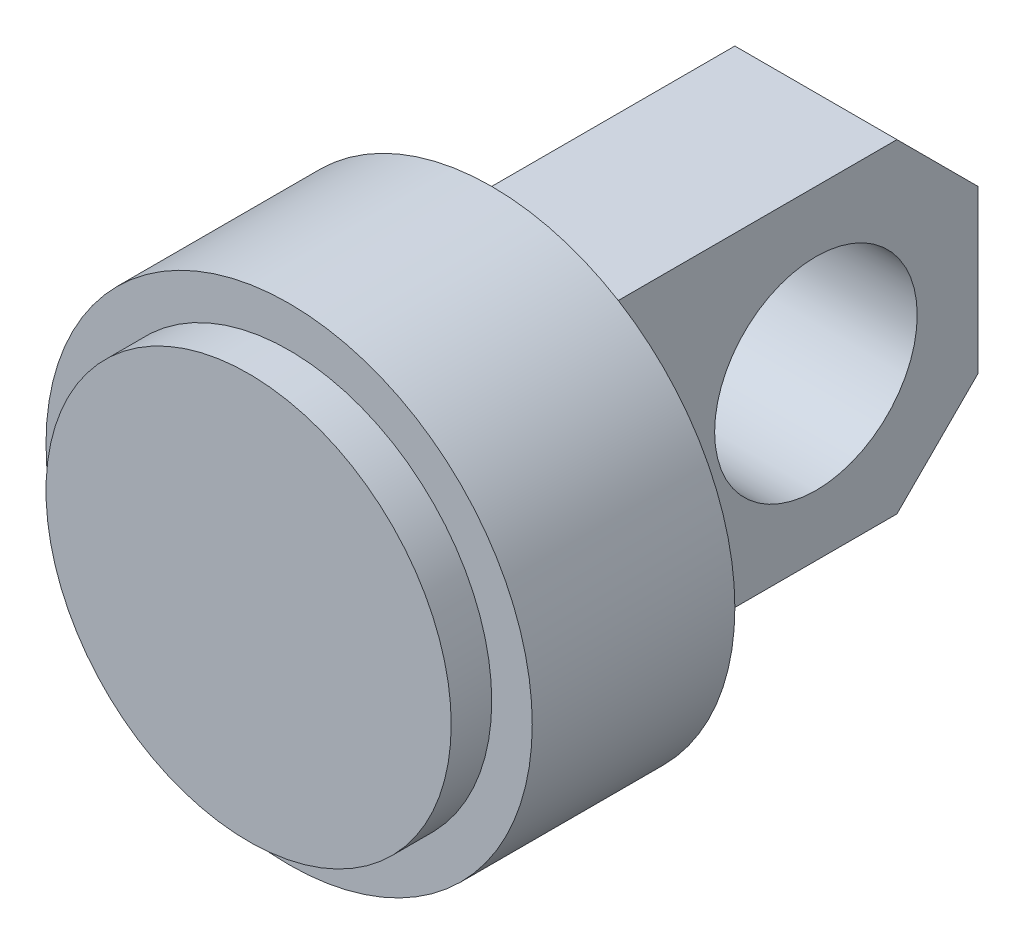
ISO-10303-21;
HEADER;
FILE_DESCRIPTION(('STEP AP214'),'2;1');
FILE_NAME('part.step','',(''),(''),'','','');
FILE_SCHEMA(('AUTOMOTIVE_DESIGN { 1 0 10303 214 1 1 1 1 }'));
ENDSEC;
DATA;
#1=APPLICATION_CONTEXT('core data for automotive mechanical design processes');
#2=APPLICATION_PROTOCOL_DEFINITION('international standard','automotive_design',2000,#1);
#3=PRODUCT_CONTEXT('',#1,'mechanical');
#4=PRODUCT('Part','Part','',(#3));
#5=PRODUCT_RELATED_PRODUCT_CATEGORY('part','',(#4));
#6=PRODUCT_DEFINITION_FORMATION('','',#4);
#7=PRODUCT_DEFINITION_CONTEXT('part definition',#1,'design');
#8=PRODUCT_DEFINITION('design','',#6,#7);
#9=PRODUCT_DEFINITION_SHAPE('','',#8);
#10=(LENGTH_UNIT() NAMED_UNIT(*) SI_UNIT(.MILLI.,.METRE.));
#11=(NAMED_UNIT(*) PLANE_ANGLE_UNIT() SI_UNIT($,.RADIAN.));
#12=(NAMED_UNIT(*) SI_UNIT($,.STERADIAN.) SOLID_ANGLE_UNIT());
#13=UNCERTAINTY_MEASURE_WITH_UNIT(LENGTH_MEASURE(1.E-05),#10,'distance_accuracy_value','');
#14=(GEOMETRIC_REPRESENTATION_CONTEXT(3) GLOBAL_UNCERTAINTY_ASSIGNED_CONTEXT((#13)) GLOBAL_UNIT_ASSIGNED_CONTEXT((#10,
#11,#12)) REPRESENTATION_CONTEXT('',''));
#15=CARTESIAN_POINT('',(0.,0.,0.));
#16=DIRECTION('',(0.,0.,1.));
#17=DIRECTION('',(1.,0.,0.));
#18=AXIS2_PLACEMENT_3D('',#15,#16,#17);
#19=CARTESIAN_POINT('',(0.,0.,5.));
#20=DIRECTION('',(0.,0.,-1.));
#21=DIRECTION('',(-1.,0.,0.));
#22=AXIS2_PLACEMENT_3D('',#19,#20,#21);
#23=CYLINDRICAL_SURFACE('',#22,25.);
#24=CARTESIAN_POINT('',(0.,0.,5.));
#25=DIRECTION('',(0.,0.,1.));
#26=DIRECTION('',(1.,0.,0.));
#27=AXIS2_PLACEMENT_3D('',#24,#25,#26);
#28=CIRCLE('',#27,25.);
#29=CARTESIAN_POINT('',(25.,0.,5.));
#30=VERTEX_POINT('',#29);
#31=EDGE_CURVE('E147',#30,#30,#28,.T.);
#32=ORIENTED_EDGE('',*,*,#31,.F.);
#33=EDGE_LOOP('',(#32));
#34=FACE_BOUND('',#33,.T.);
#35=CARTESIAN_POINT('',(0.,0.,0.));
#36=DIRECTION('',(0.,0.,1.));
#37=DIRECTION('',(1.,0.,0.));
#38=AXIS2_PLACEMENT_3D('',#35,#36,#37);
#39=CIRCLE('',#38,25.);
#40=CARTESIAN_POINT('',(25.,0.,0.));
#41=VERTEX_POINT('',#40);
#42=EDGE_CURVE('E143',#41,#41,#39,.T.);
#43=ORIENTED_EDGE('',*,*,#42,.T.);
#44=EDGE_LOOP('',(#43));
#45=FACE_BOUND('',#44,.T.);
#46=ADVANCED_FACE('F41',(#34,#45),#23,.T.);
#47=CARTESIAN_POINT('',(0.,0.,5.));
#48=DIRECTION('',(0.,0.,1.));
#49=DIRECTION('',(1.,0.,0.));
#50=AXIS2_PLACEMENT_3D('',#47,#48,#49);
#51=PLANE('',#50);
#52=ORIENTED_EDGE('',*,*,#31,.T.);
#53=EDGE_LOOP('',(#52));
#54=FACE_BOUND('',#53,.T.);
#55=ADVANCED_FACE('F197',(#54),#51,.T.);
#56=CARTESIAN_POINT('',(0.,0.,-25.));
#57=DIRECTION('',(0.,0.,1.));
#58=DIRECTION('',(1.,0.,0.));
#59=AXIS2_PLACEMENT_3D('',#56,#57,#58);
#60=CYLINDRICAL_SURFACE('',#59,30.);
#61=CARTESIAN_POINT('',(0.,0.,-25.));
#62=DIRECTION('',(0.,0.,-1.));
#63=DIRECTION('',(-1.,0.,0.));
#64=AXIS2_PLACEMENT_3D('',#61,#62,#63);
#65=CIRCLE('',#64,30.);
#66=CARTESIAN_POINT('',(-30.,0.,-25.));
#67=VERTEX_POINT('',#66);
#68=EDGE_CURVE('E139',#67,#67,#65,.T.);
#69=ORIENTED_EDGE('',*,*,#68,.F.);
#70=EDGE_LOOP('',(#69));
#71=FACE_BOUND('',#70,.T.);
#72=CARTESIAN_POINT('',(0.,0.,0.));
#73=DIRECTION('',(0.,0.,-1.));
#74=DIRECTION('',(-1.,0.,0.));
#75=AXIS2_PLACEMENT_3D('',#72,#73,#74);
#76=CIRCLE('',#75,30.);
#77=CARTESIAN_POINT('',(-30.,0.,0.));
#78=VERTEX_POINT('',#77);
#79=EDGE_CURVE('E138',#78,#78,#76,.T.);
#80=ORIENTED_EDGE('',*,*,#79,.T.);
#81=EDGE_LOOP('',(#80));
#82=FACE_BOUND('',#81,.T.);
#83=ADVANCED_FACE('F203',(#71,#82),#60,.T.);
#84=CARTESIAN_POINT('',(0.,0.,-25.));
#85=DIRECTION('',(0.,0.,-1.));
#86=DIRECTION('',(-1.,0.,0.));
#87=AXIS2_PLACEMENT_3D('',#84,#85,#86);
#88=PLANE('',#87);
#89=DIRECTION('',(0.,1.,0.));
#90=VECTOR('',#89,1.);
#91=CARTESIAN_POINT('',(-10.,-20.,-25.));
#92=LINE('',#91,#90);
#93=CARTESIAN_POINT('',(-10.,-20.,-25.));
#94=VERTEX_POINT('',#93);
#95=CARTESIAN_POINT('',(-10.,20.,-25.));
#96=VERTEX_POINT('',#95);
#97=EDGE_CURVE('E121',#94,#96,#92,.T.);
#98=ORIENTED_EDGE('',*,*,#97,.F.);
#99=DIRECTION('',(-1.,0.,0.));
#100=VECTOR('',#99,1.);
#101=CARTESIAN_POINT('',(10.,-20.,-25.));
#102=LINE('',#101,#100);
#103=CARTESIAN_POINT('',(10.,-20.,-25.));
#104=VERTEX_POINT('',#103);
#105=EDGE_CURVE('E115',#104,#94,#102,.T.);
#106=ORIENTED_EDGE('',*,*,#105,.F.);
#107=DIRECTION('',(0.,-1.,0.));
#108=VECTOR('',#107,1.);
#109=CARTESIAN_POINT('',(10.,-20.,-25.));
#110=LINE('',#109,#108);
#111=CARTESIAN_POINT('',(10.,20.,-25.));
#112=VERTEX_POINT('',#111);
#113=EDGE_CURVE('E98',#112,#104,#110,.T.);
#114=ORIENTED_EDGE('',*,*,#113,.F.);
#115=DIRECTION('',(1.,0.,0.));
#116=VECTOR('',#115,1.);
#117=CARTESIAN_POINT('',(10.,20.,-25.));
#118=LINE('',#117,#116);
#119=EDGE_CURVE('E112',#96,#112,#118,.T.);
#120=ORIENTED_EDGE('',*,*,#119,.F.);
#121=EDGE_LOOP('',(#98,#106,#114,#120));
#122=FACE_BOUND('',#121,.T.);
#123=ORIENTED_EDGE('',*,*,#68,.T.);
#124=EDGE_LOOP('',(#123));
#125=FACE_BOUND('',#124,.T.);
#126=ADVANCED_FACE('F110',(#122,#125),#88,.T.);
#127=CARTESIAN_POINT('',(0.,0.,0.));
#128=DIRECTION('',(0.,0.,-1.));
#129=DIRECTION('',(-1.,0.,0.));
#130=AXIS2_PLACEMENT_3D('',#127,#128,#129);
#131=PLANE('',#130);
#132=ORIENTED_EDGE('',*,*,#42,.F.);
#133=EDGE_LOOP('',(#132));
#134=FACE_BOUND('',#133,.T.);
#135=ORIENTED_EDGE('',*,*,#79,.F.);
#136=EDGE_LOOP('',(#135));
#137=FACE_BOUND('',#136,.T.);
#138=ADVANCED_FACE('F237',(#134,#137),#131,.F.);
#139=CARTESIAN_POINT('',(-10.,-20.,-75.));
#140=DIRECTION('',(1.,0.,0.));
#141=DIRECTION('',(0.,0.,-1.));
#142=AXIS2_PLACEMENT_3D('',#139,#140,#141);
#143=PLANE('',#142);
#144=CARTESIAN_POINT('',(-10.,0.,-55.));
#145=DIRECTION('',(-1.,0.,0.));
#146=DIRECTION('',(0.,0.,1.));
#147=AXIS2_PLACEMENT_3D('',#144,#145,#146);
#148=CIRCLE('',#147,12.5);
#149=CARTESIAN_POINT('',(-10.,0.,-42.5));
#150=VERTEX_POINT('',#149);
#151=EDGE_CURVE('E227',#150,#150,#148,.T.);
#152=ORIENTED_EDGE('',*,*,#151,.F.);
#153=EDGE_LOOP('',(#152));
#154=FACE_BOUND('',#153,.T.);
#155=DIRECTION('',(0.,1.,0.));
#156=VECTOR('',#155,1.);
#157=CARTESIAN_POINT('',(-10.,-20.,-75.));
#158=LINE('',#157,#156);
#159=CARTESIAN_POINT('',(-10.,-9.99999999999998,-75.));
#160=VERTEX_POINT('',#159);
#161=CARTESIAN_POINT('',(-10.,9.99999999999996,-75.));
#162=VERTEX_POINT('',#161);
#163=EDGE_CURVE('E129',#160,#162,#158,.T.);
#164=ORIENTED_EDGE('',*,*,#163,.F.);
#165=DIRECTION('',(0.,0.707106781186548,-0.707106781186548));
#166=VECTOR('',#165,1.);
#167=CARTESIAN_POINT('',(-10.,-9.99999999999998,-75.));
#168=LINE('',#167,#166);
#169=CARTESIAN_POINT('',(-10.,-20.,-65.));
#170=VERTEX_POINT('',#169);
#171=EDGE_CURVE('E165',#160,#170,#168,.F.);
#172=ORIENTED_EDGE('',*,*,#171,.T.);
#173=DIRECTION('',(0.,0.,1.));
#174=VECTOR('',#173,1.);
#175=CARTESIAN_POINT('',(-10.,-20.,-75.));
#176=LINE('',#175,#174);
#177=EDGE_CURVE('E130',#170,#94,#176,.T.);
#178=ORIENTED_EDGE('',*,*,#177,.T.);
#179=ORIENTED_EDGE('',*,*,#97,.T.);
#180=DIRECTION('',(0.,0.,1.));
#181=VECTOR('',#180,1.);
#182=CARTESIAN_POINT('',(-10.,20.,-75.));
#183=LINE('',#182,#181);
#184=CARTESIAN_POINT('',(-10.,20.,-65.));
#185=VERTEX_POINT('',#184);
#186=EDGE_CURVE('E103',#185,#96,#183,.T.);
#187=ORIENTED_EDGE('',*,*,#186,.F.);
#188=DIRECTION('',(0.,0.707106781186548,0.707106781186547));
#189=VECTOR('',#188,1.);
#190=CARTESIAN_POINT('',(-10.,9.99999999999996,-75.));
#191=LINE('',#190,#189);
#192=EDGE_CURVE('E162',#185,#162,#191,.F.);
#193=ORIENTED_EDGE('',*,*,#192,.T.);
#194=EDGE_LOOP('',(#164,#172,#178,#179,#187,#193));
#195=FACE_BOUND('',#194,.T.);
#196=ADVANCED_FACE('F185',(#154,#195),#143,.F.);
#197=CARTESIAN_POINT('',(10.,20.,-75.));
#198=DIRECTION('',(0.,-1.,0.));
#199=DIRECTION('',(0.,0.,-1.));
#200=AXIS2_PLACEMENT_3D('',#197,#198,#199);
#201=PLANE('',#200);
#202=DIRECTION('',(0.,0.,1.));
#203=VECTOR('',#202,1.);
#204=CARTESIAN_POINT('',(10.,20.,-75.));
#205=LINE('',#204,#203);
#206=CARTESIAN_POINT('',(10.,20.,-65.));
#207=VERTEX_POINT('',#206);
#208=EDGE_CURVE('E95',#207,#112,#205,.T.);
#209=ORIENTED_EDGE('',*,*,#208,.F.);
#210=DIRECTION('',(-1.,0.,0.));
#211=VECTOR('',#210,1.);
#212=CARTESIAN_POINT('',(10.,20.,-65.));
#213=LINE('',#212,#211);
#214=EDGE_CURVE('E11',#207,#185,#213,.T.);
#215=ORIENTED_EDGE('',*,*,#214,.T.);
#216=ORIENTED_EDGE('',*,*,#186,.T.);
#217=ORIENTED_EDGE('',*,*,#119,.T.);
#218=EDGE_LOOP('',(#209,#215,#216,#217));
#219=FACE_BOUND('',#218,.T.);
#220=ADVANCED_FACE('F118',(#219),#201,.F.);
#221=CARTESIAN_POINT('',(10.,-20.,-75.));
#222=DIRECTION('',(-1.,0.,0.));
#223=DIRECTION('',(0.,0.,1.));
#224=AXIS2_PLACEMENT_3D('',#221,#222,#223);
#225=PLANE('',#224);
#226=CARTESIAN_POINT('',(10.,0.,-55.));
#227=DIRECTION('',(-1.,0.,0.));
#228=DIRECTION('',(0.,0.,1.));
#229=AXIS2_PLACEMENT_3D('',#226,#227,#228);
#230=CIRCLE('',#229,12.5);
#231=CARTESIAN_POINT('',(10.,0.,-42.5));
#232=VERTEX_POINT('',#231);
#233=EDGE_CURVE('E46',#232,#232,#230,.T.);
#234=ORIENTED_EDGE('',*,*,#233,.T.);
#235=EDGE_LOOP('',(#234));
#236=FACE_BOUND('',#235,.T.);
#237=DIRECTION('',(0.,0.,1.));
#238=VECTOR('',#237,1.);
#239=CARTESIAN_POINT('',(10.,-20.,-75.));
#240=LINE('',#239,#238);
#241=CARTESIAN_POINT('',(10.,-20.,-65.));
#242=VERTEX_POINT('',#241);
#243=EDGE_CURVE('E104',#242,#104,#240,.T.);
#244=ORIENTED_EDGE('',*,*,#243,.F.);
#245=DIRECTION('',(0.,-0.707106781186548,0.707106781186548));
#246=VECTOR('',#245,1.);
#247=CARTESIAN_POINT('',(10.,-9.99999999999998,-75.));
#248=LINE('',#247,#246);
#249=CARTESIAN_POINT('',(10.,-9.99999999999998,-75.));
#250=VERTEX_POINT('',#249);
#251=EDGE_CURVE('E52',#242,#250,#248,.F.);
#252=ORIENTED_EDGE('',*,*,#251,.T.);
#253=DIRECTION('',(0.,-1.,0.));
#254=VECTOR('',#253,1.);
#255=CARTESIAN_POINT('',(10.,-20.,-75.));
#256=LINE('',#255,#254);
#257=CARTESIAN_POINT('',(10.,9.99999999999996,-75.));
#258=VERTEX_POINT('',#257);
#259=EDGE_CURVE('E133',#258,#250,#256,.T.);
#260=ORIENTED_EDGE('',*,*,#259,.F.);
#261=DIRECTION('',(0.,-0.707106781186548,-0.707106781186547));
#262=VECTOR('',#261,1.);
#263=CARTESIAN_POINT('',(10.,9.99999999999996,-75.));
#264=LINE('',#263,#262);
#265=EDGE_CURVE('E59',#258,#207,#264,.F.);
#266=ORIENTED_EDGE('',*,*,#265,.T.);
#267=ORIENTED_EDGE('',*,*,#208,.T.);
#268=ORIENTED_EDGE('',*,*,#113,.T.);
#269=EDGE_LOOP('',(#244,#252,#260,#266,#267,#268));
#270=FACE_BOUND('',#269,.T.);
#271=ADVANCED_FACE('F97',(#236,#270),#225,.F.);
#272=CARTESIAN_POINT('',(10.,-20.,-75.));
#273=DIRECTION('',(0.,1.,0.));
#274=DIRECTION('',(0.,0.,1.));
#275=AXIS2_PLACEMENT_3D('',#272,#273,#274);
#276=PLANE('',#275);
#277=ORIENTED_EDGE('',*,*,#177,.F.);
#278=DIRECTION('',(1.,0.,0.));
#279=VECTOR('',#278,1.);
#280=CARTESIAN_POINT('',(10.,-20.,-65.));
#281=LINE('',#280,#279);
#282=EDGE_CURVE('E67',#170,#242,#281,.T.);
#283=ORIENTED_EDGE('',*,*,#282,.T.);
#284=ORIENTED_EDGE('',*,*,#243,.T.);
#285=ORIENTED_EDGE('',*,*,#105,.T.);
#286=EDGE_LOOP('',(#277,#283,#284,#285));
#287=FACE_BOUND('',#286,.T.);
#288=ADVANCED_FACE('F186',(#287),#276,.F.);
#289=CARTESIAN_POINT('',(0.,0.,-75.));
#290=DIRECTION('',(0.,0.,1.));
#291=DIRECTION('',(1.,0.,0.));
#292=AXIS2_PLACEMENT_3D('',#289,#290,#291);
#293=PLANE('',#292);
#294=ORIENTED_EDGE('',*,*,#259,.T.);
#295=DIRECTION('',(-1.,0.,0.));
#296=VECTOR('',#295,1.);
#297=CARTESIAN_POINT('',(0.,-9.99999999999998,-75.));
#298=LINE('',#297,#296);
#299=EDGE_CURVE('E158',#250,#160,#298,.T.);
#300=ORIENTED_EDGE('',*,*,#299,.T.);
#301=ORIENTED_EDGE('',*,*,#163,.T.);
#302=DIRECTION('',(1.,0.,0.));
#303=VECTOR('',#302,1.);
#304=CARTESIAN_POINT('',(0.,9.99999999999996,-75.));
#305=LINE('',#304,#303);
#306=EDGE_CURVE('E151',#162,#258,#305,.T.);
#307=ORIENTED_EDGE('',*,*,#306,.T.);
#308=EDGE_LOOP('',(#294,#300,#301,#307));
#309=FACE_BOUND('',#308,.T.);
#310=ADVANCED_FACE('F178',(#309),#293,.F.);
#311=CARTESIAN_POINT('',(0.,-9.99999999999998,-75.));
#312=DIRECTION('',(0.,0.707106781186548,0.707106781186548));
#313=DIRECTION('',(-1.,0.,0.));
#314=AXIS2_PLACEMENT_3D('',#311,#312,#313);
#315=PLANE('',#314);
#316=ORIENTED_EDGE('',*,*,#251,.F.);
#317=ORIENTED_EDGE('',*,*,#282,.F.);
#318=ORIENTED_EDGE('',*,*,#171,.F.);
#319=ORIENTED_EDGE('',*,*,#299,.F.);
#320=EDGE_LOOP('',(#316,#317,#318,#319));
#321=FACE_BOUND('',#320,.T.);
#322=ADVANCED_FACE('F183',(#321),#315,.F.);
#323=CARTESIAN_POINT('',(0.,9.99999999999996,-75.));
#324=DIRECTION('',(0.,-0.707106781186547,0.707106781186548));
#325=DIRECTION('',(1.,0.,0.));
#326=AXIS2_PLACEMENT_3D('',#323,#324,#325);
#327=PLANE('',#326);
#328=ORIENTED_EDGE('',*,*,#192,.F.);
#329=ORIENTED_EDGE('',*,*,#214,.F.);
#330=ORIENTED_EDGE('',*,*,#265,.F.);
#331=ORIENTED_EDGE('',*,*,#306,.F.);
#332=EDGE_LOOP('',(#328,#329,#330,#331));
#333=FACE_BOUND('',#332,.T.);
#334=ADVANCED_FACE('F44',(#333),#327,.F.);
#335=CARTESIAN_POINT('',(30.,0.,-55.));
#336=DIRECTION('',(-1.,0.,0.));
#337=DIRECTION('',(0.,0.,1.));
#338=AXIS2_PLACEMENT_3D('',#335,#336,#337);
#339=CYLINDRICAL_SURFACE('',#338,12.5);
#340=ORIENTED_EDGE('',*,*,#151,.T.);
#341=EDGE_LOOP('',(#340));
#342=FACE_BOUND('',#341,.T.);
#343=ORIENTED_EDGE('',*,*,#233,.F.);
#344=EDGE_LOOP('',(#343));
#345=FACE_BOUND('',#344,.T.);
#346=ADVANCED_FACE('F216',(#342,#345),#339,.F.);
#347=CLOSED_SHELL('',(#46,#55,#83,#126,#138,#196,#220,#271,#288,#310,#322,#334,#346));
#348=MANIFOLD_SOLID_BREP('B2',#347);
#349=ADVANCED_BREP_SHAPE_REPRESENTATION('',(#18,#348),#14);
#350=SHAPE_DEFINITION_REPRESENTATION(#9,#349);
ENDSEC;
END-ISO-10303-21;
